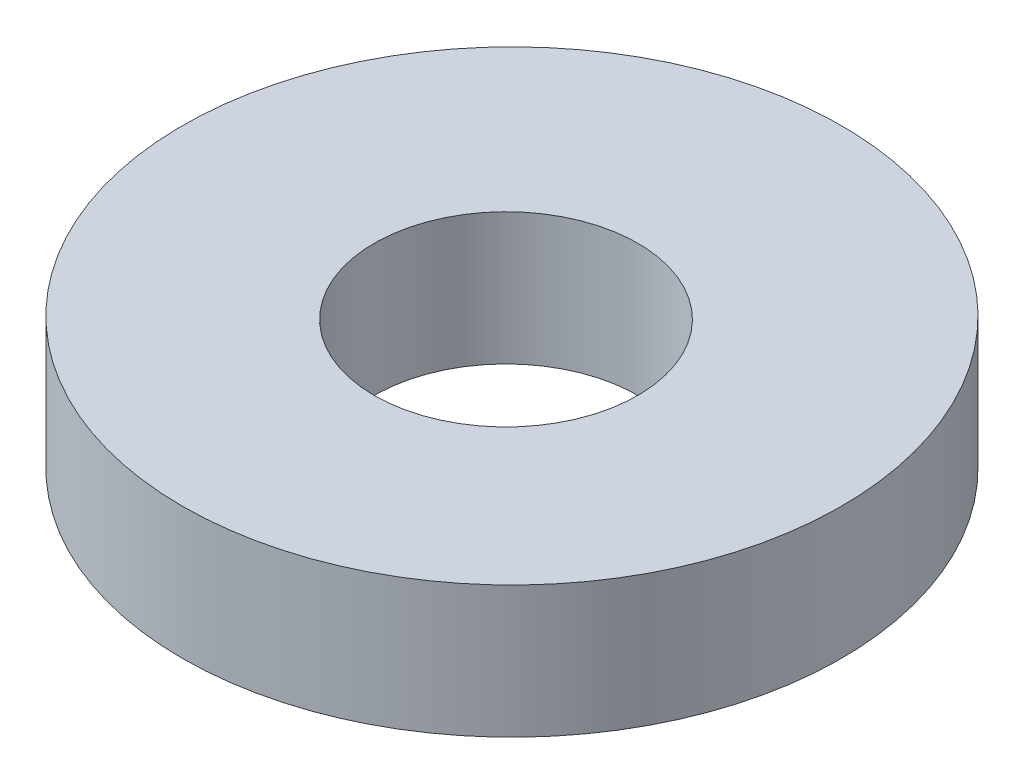
ISO-10303-21;
HEADER;
FILE_DESCRIPTION(('STEP AP214'),'2;1');
FILE_NAME('part.step','',(''),(''),'','','');
FILE_SCHEMA(('AUTOMOTIVE_DESIGN { 1 0 10303 214 1 1 1 1 }'));
ENDSEC;
DATA;
#1=APPLICATION_CONTEXT('core data for automotive mechanical design processes');
#2=APPLICATION_PROTOCOL_DEFINITION('international standard','automotive_design',2000,#1);
#3=PRODUCT_CONTEXT('',#1,'mechanical');
#4=PRODUCT('Part','Part','',(#3));
#5=PRODUCT_RELATED_PRODUCT_CATEGORY('part','',(#4));
#6=PRODUCT_DEFINITION_FORMATION('','',#4);
#7=PRODUCT_DEFINITION_CONTEXT('part definition',#1,'design');
#8=PRODUCT_DEFINITION('design','',#6,#7);
#9=PRODUCT_DEFINITION_SHAPE('','',#8);
#10=(LENGTH_UNIT() NAMED_UNIT(*) SI_UNIT(.MILLI.,.METRE.));
#11=(NAMED_UNIT(*) PLANE_ANGLE_UNIT() SI_UNIT($,.RADIAN.));
#12=(NAMED_UNIT(*) SI_UNIT($,.STERADIAN.) SOLID_ANGLE_UNIT());
#13=UNCERTAINTY_MEASURE_WITH_UNIT(LENGTH_MEASURE(1.E-05),#10,'distance_accuracy_value','');
#14=(GEOMETRIC_REPRESENTATION_CONTEXT(3) GLOBAL_UNCERTAINTY_ASSIGNED_CONTEXT((#13)) GLOBAL_UNIT_ASSIGNED_CONTEXT((#10,
#11,#12)) REPRESENTATION_CONTEXT('',''));
#15=CARTESIAN_POINT('',(0.,0.,0.));
#16=DIRECTION('',(0.,0.,1.));
#17=DIRECTION('',(1.,0.,0.));
#18=AXIS2_PLACEMENT_3D('',#15,#16,#17);
#19=CARTESIAN_POINT('',(0.,5.,0.));
#20=DIRECTION('',(0.,1.,0.));
#21=DIRECTION('',(0.,0.,1.));
#22=AXIS2_PLACEMENT_3D('',#19,#20,#21);
#23=PLANE('',#22);
#24=CARTESIAN_POINT('',(0.,5.,0.));
#25=DIRECTION('',(0.,1.,0.));
#26=DIRECTION('',(0.,0.,1.));
#27=AXIS2_PLACEMENT_3D('',#24,#25,#26);
#28=CIRCLE('',#27,12.5);
#29=CARTESIAN_POINT('',(0.,5.,12.5));
#30=VERTEX_POINT('',#29);
#31=EDGE_CURVE('E10',#30,#30,#28,.T.);
#32=ORIENTED_EDGE('',*,*,#31,.T.);
#33=EDGE_LOOP('',(#32));
#34=FACE_BOUND('',#33,.T.);
#35=CARTESIAN_POINT('',(0.,5.,0.224617503647551));
#36=DIRECTION('',(0.,1.,0.));
#37=DIRECTION('',(0.,0.,1.));
#38=AXIS2_PLACEMENT_3D('',#35,#36,#37);
#39=CIRCLE('',#38,5.);
#40=CARTESIAN_POINT('',(0.,5.,5.22461750364755));
#41=VERTEX_POINT('',#40);
#42=EDGE_CURVE('E41',#41,#41,#39,.T.);
#43=ORIENTED_EDGE('',*,*,#42,.F.);
#44=EDGE_LOOP('',(#43));
#45=FACE_BOUND('',#44,.T.);
#46=ADVANCED_FACE('F30',(#34,#45),#23,.T.);
#47=CARTESIAN_POINT('',(0.,0.,0.));
#48=DIRECTION('',(0.,1.,0.));
#49=DIRECTION('',(0.,0.,1.));
#50=AXIS2_PLACEMENT_3D('',#47,#48,#49);
#51=PLANE('',#50);
#52=CARTESIAN_POINT('',(0.,0.,0.));
#53=DIRECTION('',(0.,1.,0.));
#54=DIRECTION('',(0.,0.,1.));
#55=AXIS2_PLACEMENT_3D('',#52,#53,#54);
#56=CIRCLE('',#55,12.5);
#57=CARTESIAN_POINT('',(0.,0.,12.5));
#58=VERTEX_POINT('',#57);
#59=EDGE_CURVE('E34',#58,#58,#56,.T.);
#60=ORIENTED_EDGE('',*,*,#59,.F.);
#61=EDGE_LOOP('',(#60));
#62=FACE_BOUND('',#61,.T.);
#63=CARTESIAN_POINT('',(0.,0.,0.224617503647551));
#64=DIRECTION('',(0.,1.,0.));
#65=DIRECTION('',(0.,0.,1.));
#66=AXIS2_PLACEMENT_3D('',#63,#64,#65);
#67=CIRCLE('',#66,5.);
#68=CARTESIAN_POINT('',(0.,0.,5.22461750364755));
#69=VERTEX_POINT('',#68);
#70=EDGE_CURVE('E43',#69,#69,#67,.T.);
#71=ORIENTED_EDGE('',*,*,#70,.T.);
#72=EDGE_LOOP('',(#71));
#73=FACE_BOUND('',#72,.T.);
#74=ADVANCED_FACE('F53',(#62,#73),#51,.F.);
#75=CARTESIAN_POINT('',(0.,5.,0.));
#76=DIRECTION('',(0.,-1.,0.));
#77=DIRECTION('',(0.,0.,-1.));
#78=AXIS2_PLACEMENT_3D('',#75,#76,#77);
#79=CYLINDRICAL_SURFACE('',#78,12.5);
#80=ORIENTED_EDGE('',*,*,#31,.F.);
#81=EDGE_LOOP('',(#80));
#82=FACE_BOUND('',#81,.T.);
#83=ORIENTED_EDGE('',*,*,#59,.T.);
#84=EDGE_LOOP('',(#83));
#85=FACE_BOUND('',#84,.T.);
#86=ADVANCED_FACE('F32',(#82,#85),#79,.T.);
#87=CARTESIAN_POINT('',(0.,5.,0.224617503647551));
#88=DIRECTION('',(0.,-1.,0.));
#89=DIRECTION('',(0.,0.,-1.));
#90=AXIS2_PLACEMENT_3D('',#87,#88,#89);
#91=CYLINDRICAL_SURFACE('',#90,5.);
#92=ORIENTED_EDGE('',*,*,#42,.T.);
#93=EDGE_LOOP('',(#92));
#94=FACE_BOUND('',#93,.T.);
#95=ORIENTED_EDGE('',*,*,#70,.F.);
#96=EDGE_LOOP('',(#95));
#97=FACE_BOUND('',#96,.T.);
#98=ADVANCED_FACE('F49',(#94,#97),#91,.F.);
#99=CLOSED_SHELL('',(#46,#74,#86,#98));
#100=MANIFOLD_SOLID_BREP('B2',#99);
#101=ADVANCED_BREP_SHAPE_REPRESENTATION('',(#18,#100),#14);
#102=SHAPE_DEFINITION_REPRESENTATION(#9,#101);
ENDSEC;
END-ISO-10303-21;
